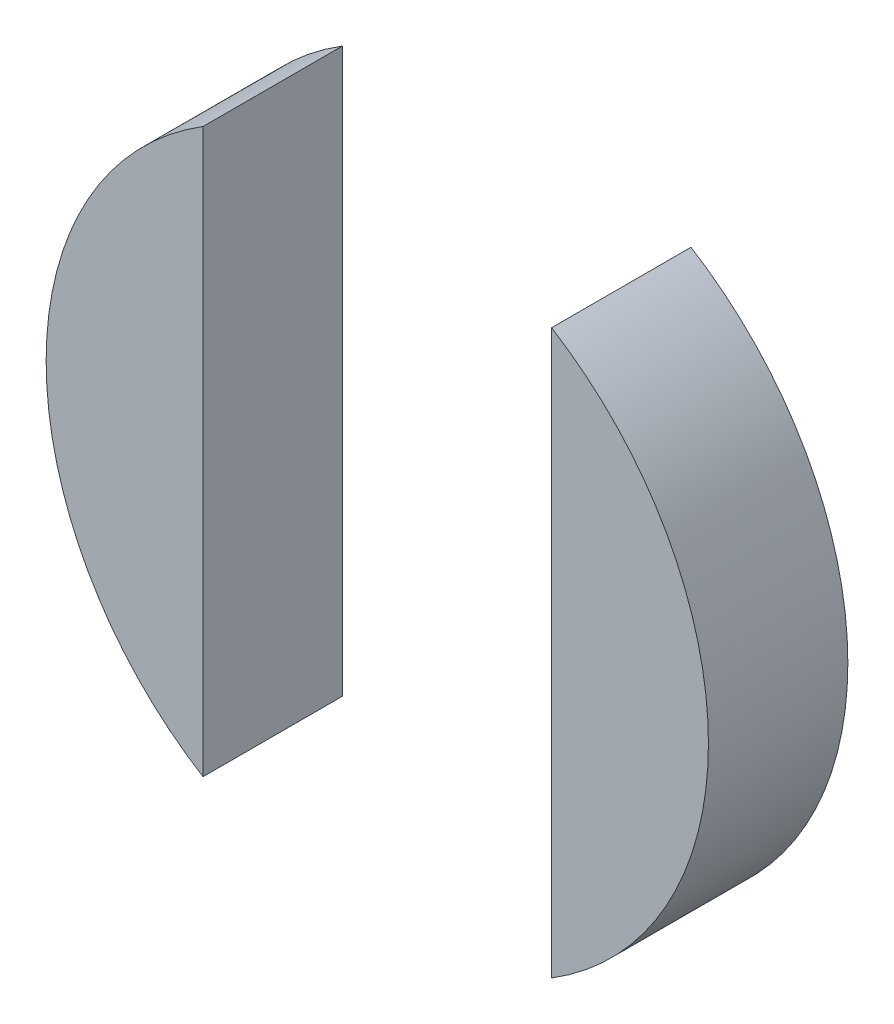
ISO-10303-21;
HEADER;
FILE_DESCRIPTION(('STEP AP214'),'2;1');
FILE_NAME('part.step','',(''),(''),'','','');
FILE_SCHEMA(('AUTOMOTIVE_DESIGN { 1 0 10303 214 1 1 1 1 }'));
ENDSEC;
DATA;
#1=APPLICATION_CONTEXT('core data for automotive mechanical design processes');
#2=APPLICATION_PROTOCOL_DEFINITION('international standard','automotive_design',2000,#1);
#3=PRODUCT_CONTEXT('',#1,'mechanical');
#4=PRODUCT('Part','Part','',(#3));
#5=PRODUCT_RELATED_PRODUCT_CATEGORY('part','',(#4));
#6=PRODUCT_DEFINITION_FORMATION('','',#4);
#7=PRODUCT_DEFINITION_CONTEXT('part definition',#1,'design');
#8=PRODUCT_DEFINITION('design','',#6,#7);
#9=PRODUCT_DEFINITION_SHAPE('','',#8);
#10=(LENGTH_UNIT() NAMED_UNIT(*) SI_UNIT(.MILLI.,.METRE.));
#11=(NAMED_UNIT(*) PLANE_ANGLE_UNIT() SI_UNIT($,.RADIAN.));
#12=(NAMED_UNIT(*) SI_UNIT($,.STERADIAN.) SOLID_ANGLE_UNIT());
#13=UNCERTAINTY_MEASURE_WITH_UNIT(LENGTH_MEASURE(1.E-05),#10,'distance_accuracy_value','');
#14=(GEOMETRIC_REPRESENTATION_CONTEXT(3) GLOBAL_UNCERTAINTY_ASSIGNED_CONTEXT((#13)) GLOBAL_UNIT_ASSIGNED_CONTEXT((#10,
#11,#12)) REPRESENTATION_CONTEXT('',''));
#15=CARTESIAN_POINT('',(0.,0.,0.));
#16=DIRECTION('',(0.,0.,1.));
#17=DIRECTION('',(1.,0.,0.));
#18=AXIS2_PLACEMENT_3D('',#15,#16,#17);
#19=CARTESIAN_POINT('',(0.,0.,4.));
#20=DIRECTION('',(0.,0.,-1.));
#21=DIRECTION('',(-1.,0.,0.));
#22=AXIS2_PLACEMENT_3D('',#19,#20,#21);
#23=CYLINDRICAL_SURFACE('',#22,9.5);
#24=CARTESIAN_POINT('',(0.,0.,0.));
#25=DIRECTION('',(0.,0.,1.));
#26=DIRECTION('',(-1.,0.,0.));
#27=AXIS2_PLACEMENT_3D('',#24,#25,#26);
#28=CIRCLE('',#27,9.5);
#29=CARTESIAN_POINT('',(5.,-8.07774721070176,0.));
#30=VERTEX_POINT('',#29);
#31=CARTESIAN_POINT('',(5.,8.07774721070176,0.));
#32=VERTEX_POINT('',#31);
#33=EDGE_CURVE('E74',#30,#32,#28,.T.);
#34=ORIENTED_EDGE('',*,*,#33,.T.);
#35=DIRECTION('',(0.,0.,-1.));
#36=VECTOR('',#35,1.);
#37=CARTESIAN_POINT('',(5.,8.07774721070176,4.));
#38=LINE('',#37,#36);
#39=CARTESIAN_POINT('',(5.,8.07774721070176,4.));
#40=VERTEX_POINT('',#39);
#41=EDGE_CURVE('E12',#40,#32,#38,.T.);
#42=ORIENTED_EDGE('',*,*,#41,.F.);
#43=CARTESIAN_POINT('',(0.,0.,4.));
#44=DIRECTION('',(0.,0.,1.));
#45=DIRECTION('',(-1.,0.,0.));
#46=AXIS2_PLACEMENT_3D('',#43,#44,#45);
#47=CIRCLE('',#46,9.5);
#48=CARTESIAN_POINT('',(5.,-8.07774721070176,4.));
#49=VERTEX_POINT('',#48);
#50=EDGE_CURVE('E73',#49,#40,#47,.T.);
#51=ORIENTED_EDGE('',*,*,#50,.F.);
#52=DIRECTION('',(0.,0.,-1.));
#53=VECTOR('',#52,1.);
#54=CARTESIAN_POINT('',(5.,-8.07774721070176,4.));
#55=LINE('',#54,#53);
#56=EDGE_CURVE('E51',#49,#30,#55,.T.);
#57=ORIENTED_EDGE('',*,*,#56,.T.);
#58=EDGE_LOOP('',(#34,#42,#51,#57));
#59=FACE_BOUND('',#58,.T.);
#60=ADVANCED_FACE('F43',(#59),#23,.T.);
#61=CARTESIAN_POINT('',(5.,8.07774721070176,4.));
#62=DIRECTION('',(1.,0.,0.));
#63=DIRECTION('',(0.,0.,-1.));
#64=AXIS2_PLACEMENT_3D('',#61,#62,#63);
#65=PLANE('',#64);
#66=DIRECTION('',(0.,-1.,0.));
#67=VECTOR('',#66,1.);
#68=CARTESIAN_POINT('',(5.,8.07774721070176,0.));
#69=LINE('',#68,#67);
#70=EDGE_CURVE('E66',#32,#30,#69,.T.);
#71=ORIENTED_EDGE('',*,*,#70,.T.);
#72=ORIENTED_EDGE('',*,*,#56,.F.);
#73=DIRECTION('',(0.,-1.,0.));
#74=VECTOR('',#73,1.);
#75=CARTESIAN_POINT('',(5.,8.07774721070176,4.));
#76=LINE('',#75,#74);
#77=EDGE_CURVE('E58',#40,#49,#76,.T.);
#78=ORIENTED_EDGE('',*,*,#77,.F.);
#79=ORIENTED_EDGE('',*,*,#41,.T.);
#80=EDGE_LOOP('',(#71,#72,#78,#79));
#81=FACE_BOUND('',#80,.T.);
#82=ADVANCED_FACE('F69',(#81),#65,.F.);
#83=CARTESIAN_POINT('',(0.,0.,4.));
#84=DIRECTION('',(0.,0.,-1.));
#85=DIRECTION('',(-1.,0.,0.));
#86=AXIS2_PLACEMENT_3D('',#83,#84,#85);
#87=PLANE('',#86);
#88=ORIENTED_EDGE('',*,*,#50,.T.);
#89=ORIENTED_EDGE('',*,*,#77,.T.);
#90=EDGE_LOOP('',(#88,#89));
#91=FACE_BOUND('',#90,.T.);
#92=ADVANCED_FACE('F81',(#91),#87,.F.);
#93=CARTESIAN_POINT('',(0.,0.,0.));
#94=DIRECTION('',(0.,0.,-1.));
#95=DIRECTION('',(-1.,0.,0.));
#96=AXIS2_PLACEMENT_3D('',#93,#94,#95);
#97=PLANE('',#96);
#98=ORIENTED_EDGE('',*,*,#33,.F.);
#99=ORIENTED_EDGE('',*,*,#70,.F.);
#100=EDGE_LOOP('',(#98,#99));
#101=FACE_BOUND('',#100,.T.);
#102=ADVANCED_FACE('F77',(#101),#97,.T.);
#103=CLOSED_SHELL('',(#60,#82,#92,#102));
#104=MANIFOLD_SOLID_BREP('B2',#103);
#105=CARTESIAN_POINT('',(0.,0.,4.));
#106=DIRECTION('',(0.,0.,-1.));
#107=DIRECTION('',(-1.,0.,0.));
#108=AXIS2_PLACEMENT_3D('',#105,#106,#107);
#109=CYLINDRICAL_SURFACE('',#108,9.5);
#110=CARTESIAN_POINT('',(0.,0.,0.));
#111=DIRECTION('',(0.,0.,1.));
#112=DIRECTION('',(1.,0.,0.));
#113=AXIS2_PLACEMENT_3D('',#110,#111,#112);
#114=CIRCLE('',#113,9.5);
#115=CARTESIAN_POINT('',(-5.,8.07774721070176,0.));
#116=VERTEX_POINT('',#115);
#117=CARTESIAN_POINT('',(-5.,-8.07774721070176,0.));
#118=VERTEX_POINT('',#117);
#119=EDGE_CURVE('E146',#116,#118,#114,.T.);
#120=ORIENTED_EDGE('',*,*,#119,.T.);
#121=DIRECTION('',(0.,0.,-1.));
#122=VECTOR('',#121,1.);
#123=CARTESIAN_POINT('',(-5.,-8.07774721070176,4.));
#124=LINE('',#123,#122);
#125=CARTESIAN_POINT('',(-5.,-8.07774721070176,4.));
#126=VERTEX_POINT('',#125);
#127=EDGE_CURVE('E41',#126,#118,#124,.T.);
#128=ORIENTED_EDGE('',*,*,#127,.F.);
#129=CARTESIAN_POINT('',(0.,0.,4.));
#130=DIRECTION('',(0.,0.,1.));
#131=DIRECTION('',(1.,0.,0.));
#132=AXIS2_PLACEMENT_3D('',#129,#130,#131);
#133=CIRCLE('',#132,9.5);
#134=CARTESIAN_POINT('',(-5.,8.07774721070176,4.));
#135=VERTEX_POINT('',#134);
#136=EDGE_CURVE('E145',#135,#126,#133,.T.);
#137=ORIENTED_EDGE('',*,*,#136,.F.);
#138=DIRECTION('',(0.,0.,-1.));
#139=VECTOR('',#138,1.);
#140=CARTESIAN_POINT('',(-5.,8.07774721070176,4.));
#141=LINE('',#140,#139);
#142=EDGE_CURVE('E123',#135,#116,#141,.T.);
#143=ORIENTED_EDGE('',*,*,#142,.T.);
#144=EDGE_LOOP('',(#120,#128,#137,#143));
#145=FACE_BOUND('',#144,.T.);
#146=ADVANCED_FACE('F115',(#145),#109,.T.);
#147=CARTESIAN_POINT('',(-5.,8.07774721070176,4.));
#148=DIRECTION('',(-1.,0.,0.));
#149=DIRECTION('',(0.,0.,1.));
#150=AXIS2_PLACEMENT_3D('',#147,#148,#149);
#151=PLANE('',#150);
#152=DIRECTION('',(0.,1.,0.));
#153=VECTOR('',#152,1.);
#154=CARTESIAN_POINT('',(-5.,8.07774721070176,0.));
#155=LINE('',#154,#153);
#156=EDGE_CURVE('E138',#118,#116,#155,.T.);
#157=ORIENTED_EDGE('',*,*,#156,.T.);
#158=ORIENTED_EDGE('',*,*,#142,.F.);
#159=DIRECTION('',(0.,1.,0.));
#160=VECTOR('',#159,1.);
#161=CARTESIAN_POINT('',(-5.,8.07774721070176,4.));
#162=LINE('',#161,#160);
#163=EDGE_CURVE('E130',#126,#135,#162,.T.);
#164=ORIENTED_EDGE('',*,*,#163,.F.);
#165=ORIENTED_EDGE('',*,*,#127,.T.);
#166=EDGE_LOOP('',(#157,#158,#164,#165));
#167=FACE_BOUND('',#166,.T.);
#168=ADVANCED_FACE('F141',(#167),#151,.F.);
#169=CARTESIAN_POINT('',(0.,0.,4.));
#170=DIRECTION('',(0.,0.,1.));
#171=DIRECTION('',(1.,0.,0.));
#172=AXIS2_PLACEMENT_3D('',#169,#170,#171);
#173=PLANE('',#172);
#174=ORIENTED_EDGE('',*,*,#136,.T.);
#175=ORIENTED_EDGE('',*,*,#163,.T.);
#176=EDGE_LOOP('',(#174,#175));
#177=FACE_BOUND('',#176,.T.);
#178=ADVANCED_FACE('F153',(#177),#173,.T.);
#179=CARTESIAN_POINT('',(0.,0.,0.));
#180=DIRECTION('',(0.,0.,1.));
#181=DIRECTION('',(1.,0.,0.));
#182=AXIS2_PLACEMENT_3D('',#179,#180,#181);
#183=PLANE('',#182);
#184=ORIENTED_EDGE('',*,*,#119,.F.);
#185=ORIENTED_EDGE('',*,*,#156,.F.);
#186=EDGE_LOOP('',(#184,#185));
#187=FACE_BOUND('',#186,.T.);
#188=ADVANCED_FACE('F149',(#187),#183,.F.);
#189=CLOSED_SHELL('',(#146,#168,#178,#188));
#190=MANIFOLD_SOLID_BREP('B6',#189);
#191=ADVANCED_BREP_SHAPE_REPRESENTATION('',(#18,#104,#190),#14);
#192=SHAPE_DEFINITION_REPRESENTATION(#9,#191);
ENDSEC;
END-ISO-10303-21;
